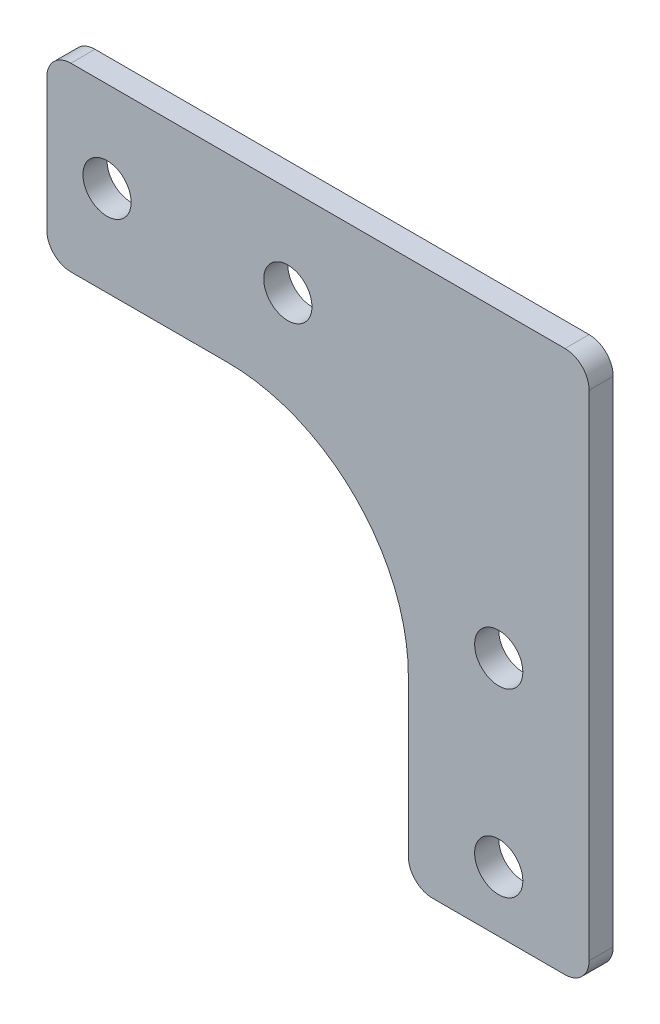
ISO-10303-21;
HEADER;
FILE_DESCRIPTION(('STEP AP214'),'2;1');
FILE_NAME('part.step','',(''),(''),'','','');
FILE_SCHEMA(('AUTOMOTIVE_DESIGN { 1 0 10303 214 1 1 1 1 }'));
ENDSEC;
DATA;
#1=APPLICATION_CONTEXT('core data for automotive mechanical design processes');
#2=APPLICATION_PROTOCOL_DEFINITION('international standard','automotive_design',2000,#1);
#3=PRODUCT_CONTEXT('',#1,'mechanical');
#4=PRODUCT('Part','Part','',(#3));
#5=PRODUCT_RELATED_PRODUCT_CATEGORY('part','',(#4));
#6=PRODUCT_DEFINITION_FORMATION('','',#4);
#7=PRODUCT_DEFINITION_CONTEXT('part definition',#1,'design');
#8=PRODUCT_DEFINITION('design','',#6,#7);
#9=PRODUCT_DEFINITION_SHAPE('','',#8);
#10=(LENGTH_UNIT() NAMED_UNIT(*) SI_UNIT(.MILLI.,.METRE.));
#11=(NAMED_UNIT(*) PLANE_ANGLE_UNIT() SI_UNIT($,.RADIAN.));
#12=(NAMED_UNIT(*) SI_UNIT($,.STERADIAN.) SOLID_ANGLE_UNIT());
#13=UNCERTAINTY_MEASURE_WITH_UNIT(LENGTH_MEASURE(1.E-05),#10,'distance_accuracy_value','');
#14=(GEOMETRIC_REPRESENTATION_CONTEXT(3) GLOBAL_UNCERTAINTY_ASSIGNED_CONTEXT((#13)) GLOBAL_UNIT_ASSIGNED_CONTEXT((#10,
#11,#12)) REPRESENTATION_CONTEXT('',''));
#15=CARTESIAN_POINT('',(0.,0.,0.));
#16=DIRECTION('',(0.,0.,1.));
#17=DIRECTION('',(1.,0.,0.));
#18=AXIS2_PLACEMENT_3D('',#15,#16,#17);
#19=CARTESIAN_POINT('',(-45.,0.,2.));
#20=DIRECTION('',(0.,-1.,0.));
#21=DIRECTION('',(0.,0.,-1.));
#22=AXIS2_PLACEMENT_3D('',#19,#20,#21);
#23=PLANE('',#22);
#24=DIRECTION('',(-1.,0.,0.));
#25=VECTOR('',#24,1.);
#26=CARTESIAN_POINT('',(-45.,0.,2.));
#27=LINE('',#26,#25);
#28=CARTESIAN_POINT('',(-2.00000000000002,0.,2.));
#29=VERTEX_POINT('',#28);
#30=CARTESIAN_POINT('',(-43.,0.,2.));
#31=VERTEX_POINT('',#30);
#32=EDGE_CURVE('E173',#29,#31,#27,.T.);
#33=ORIENTED_EDGE('',*,*,#32,.F.);
#34=DIRECTION('',(0.,0.,-1.));
#35=VECTOR('',#34,1.);
#36=CARTESIAN_POINT('',(-2.,0.,2.));
#37=LINE('',#36,#35);
#38=CARTESIAN_POINT('',(-2.00000000000002,0.,0.));
#39=VERTEX_POINT('',#38);
#40=EDGE_CURVE('E205',#29,#39,#37,.T.);
#41=ORIENTED_EDGE('',*,*,#40,.T.);
#42=DIRECTION('',(-1.,0.,0.));
#43=VECTOR('',#42,1.);
#44=CARTESIAN_POINT('',(-45.,0.,0.));
#45=LINE('',#44,#43);
#46=CARTESIAN_POINT('',(-43.,0.,0.));
#47=VERTEX_POINT('',#46);
#48=EDGE_CURVE('E155',#39,#47,#45,.T.);
#49=ORIENTED_EDGE('',*,*,#48,.T.);
#50=DIRECTION('',(0.,0.,-1.));
#51=VECTOR('',#50,1.);
#52=CARTESIAN_POINT('',(-43.,0.,2.));
#53=LINE('',#52,#51);
#54=EDGE_CURVE('E203',#47,#31,#53,.F.);
#55=ORIENTED_EDGE('',*,*,#54,.T.);
#56=EDGE_LOOP('',(#33,#41,#49,#55));
#57=FACE_BOUND('',#56,.T.);
#58=ADVANCED_FACE('F33',(#57),#23,.F.);
#59=CARTESIAN_POINT('',(-45.,-15.,2.));
#60=DIRECTION('',(1.,0.,0.));
#61=DIRECTION('',(0.,0.,-1.));
#62=AXIS2_PLACEMENT_3D('',#59,#60,#61);
#63=PLANE('',#62);
#64=DIRECTION('',(0.,-1.,0.));
#65=VECTOR('',#64,1.);
#66=CARTESIAN_POINT('',(-45.,-15.,0.));
#67=LINE('',#66,#65);
#68=CARTESIAN_POINT('',(-45.,-2.,0.));
#69=VERTEX_POINT('',#68);
#70=CARTESIAN_POINT('',(-45.,-13.,0.));
#71=VERTEX_POINT('',#70);
#72=EDGE_CURVE('E158',#69,#71,#67,.T.);
#73=ORIENTED_EDGE('',*,*,#72,.T.);
#74=DIRECTION('',(0.,0.,-1.));
#75=VECTOR('',#74,1.);
#76=CARTESIAN_POINT('',(-45.,-13.,2.));
#77=LINE('',#76,#75);
#78=CARTESIAN_POINT('',(-45.,-13.,2.));
#79=VERTEX_POINT('',#78);
#80=EDGE_CURVE('E11',#71,#79,#77,.F.);
#81=ORIENTED_EDGE('',*,*,#80,.T.);
#82=DIRECTION('',(0.,-1.,0.));
#83=VECTOR('',#82,1.);
#84=CARTESIAN_POINT('',(-45.,-15.,2.));
#85=LINE('',#84,#83);
#86=CARTESIAN_POINT('',(-45.,-2.,2.));
#87=VERTEX_POINT('',#86);
#88=EDGE_CURVE('E131',#87,#79,#85,.T.);
#89=ORIENTED_EDGE('',*,*,#88,.F.);
#90=DIRECTION('',(0.,0.,-1.));
#91=VECTOR('',#90,1.);
#92=CARTESIAN_POINT('',(-45.,-2.,2.));
#93=LINE('',#92,#91);
#94=EDGE_CURVE('E41',#87,#69,#93,.T.);
#95=ORIENTED_EDGE('',*,*,#94,.T.);
#96=EDGE_LOOP('',(#73,#81,#89,#95));
#97=FACE_BOUND('',#96,.T.);
#98=ADVANCED_FACE('F215',(#97),#63,.F.);
#99=CARTESIAN_POINT('',(-30.,-15.,2.));
#100=DIRECTION('',(0.,1.,0.));
#101=DIRECTION('',(0.,0.,1.));
#102=AXIS2_PLACEMENT_3D('',#99,#100,#101);
#103=PLANE('',#102);
#104=DIRECTION('',(1.,0.,0.));
#105=VECTOR('',#104,1.);
#106=CARTESIAN_POINT('',(-30.,-15.,2.));
#107=LINE('',#106,#105);
#108=CARTESIAN_POINT('',(-43.,-15.,2.));
#109=VERTEX_POINT('',#108);
#110=CARTESIAN_POINT('',(-30.,-15.,2.));
#111=VERTEX_POINT('',#110);
#112=EDGE_CURVE('E121',#109,#111,#107,.T.);
#113=ORIENTED_EDGE('',*,*,#112,.F.);
#114=DIRECTION('',(0.,0.,-1.));
#115=VECTOR('',#114,1.);
#116=CARTESIAN_POINT('',(-43.,-15.,2.));
#117=LINE('',#116,#115);
#118=CARTESIAN_POINT('',(-43.,-15.,0.));
#119=VERTEX_POINT('',#118);
#120=EDGE_CURVE('E209',#109,#119,#117,.T.);
#121=ORIENTED_EDGE('',*,*,#120,.T.);
#122=DIRECTION('',(1.,0.,0.));
#123=VECTOR('',#122,1.);
#124=CARTESIAN_POINT('',(-30.,-15.,0.));
#125=LINE('',#124,#123);
#126=CARTESIAN_POINT('',(-30.,-15.,0.));
#127=VERTEX_POINT('',#126);
#128=EDGE_CURVE('E137',#119,#127,#125,.T.);
#129=ORIENTED_EDGE('',*,*,#128,.T.);
#130=DIRECTION('',(0.,0.,-1.));
#131=VECTOR('',#130,1.);
#132=CARTESIAN_POINT('',(-30.,-15.,2.));
#133=LINE('',#132,#131);
#134=EDGE_CURVE('E134',#111,#127,#133,.T.);
#135=ORIENTED_EDGE('',*,*,#134,.F.);
#136=EDGE_LOOP('',(#113,#121,#129,#135));
#137=FACE_BOUND('',#136,.T.);
#138=ADVANCED_FACE('F135',(#137),#103,.F.);
#139=CARTESIAN_POINT('',(-30.,-30.,2.));
#140=DIRECTION('',(0.,0.,-1.));
#141=DIRECTION('',(-1.,0.,0.));
#142=AXIS2_PLACEMENT_3D('',#139,#140,#141);
#143=CYLINDRICAL_SURFACE('',#142,15.);
#144=CARTESIAN_POINT('',(-30.,-30.,0.));
#145=DIRECTION('',(0.,0.,-1.));
#146=DIRECTION('',(1.,0.,0.));
#147=AXIS2_PLACEMENT_3D('',#144,#145,#146);
#148=CIRCLE('',#147,15.);
#149=CARTESIAN_POINT('',(-15.,-30.,0.));
#150=VERTEX_POINT('',#149);
#151=EDGE_CURVE('E163',#127,#150,#148,.T.);
#152=ORIENTED_EDGE('',*,*,#151,.T.);
#153=DIRECTION('',(0.,0.,-1.));
#154=VECTOR('',#153,1.);
#155=CARTESIAN_POINT('',(-15.,-30.,2.));
#156=LINE('',#155,#154);
#157=CARTESIAN_POINT('',(-15.,-30.,2.));
#158=VERTEX_POINT('',#157);
#159=EDGE_CURVE('E141',#158,#150,#156,.T.);
#160=ORIENTED_EDGE('',*,*,#159,.F.);
#161=CARTESIAN_POINT('',(-30.,-30.,2.));
#162=DIRECTION('',(0.,0.,-1.));
#163=DIRECTION('',(1.,0.,0.));
#164=AXIS2_PLACEMENT_3D('',#161,#162,#163);
#165=CIRCLE('',#164,15.);
#166=EDGE_CURVE('E126',#111,#158,#165,.T.);
#167=ORIENTED_EDGE('',*,*,#166,.F.);
#168=ORIENTED_EDGE('',*,*,#134,.T.);
#169=EDGE_LOOP('',(#152,#160,#167,#168));
#170=FACE_BOUND('',#169,.T.);
#171=ADVANCED_FACE('F143',(#170),#143,.F.);
#172=CARTESIAN_POINT('',(-15.,-45.,2.));
#173=DIRECTION('',(1.,0.,0.));
#174=DIRECTION('',(0.,1.,0.));
#175=AXIS2_PLACEMENT_3D('',#172,#173,#174);
#176=PLANE('',#175);
#177=DIRECTION('',(0.,-1.,0.));
#178=VECTOR('',#177,1.);
#179=CARTESIAN_POINT('',(-15.,-45.,0.));
#180=LINE('',#179,#178);
#181=CARTESIAN_POINT('',(-15.,-43.,0.));
#182=VERTEX_POINT('',#181);
#183=EDGE_CURVE('E165',#150,#182,#180,.T.);
#184=ORIENTED_EDGE('',*,*,#183,.T.);
#185=DIRECTION('',(0.,0.,-1.));
#186=VECTOR('',#185,1.);
#187=CARTESIAN_POINT('',(-15.,-43.,2.));
#188=LINE('',#187,#186);
#189=CARTESIAN_POINT('',(-15.,-43.,2.));
#190=VERTEX_POINT('',#189);
#191=EDGE_CURVE('E48',#182,#190,#188,.F.);
#192=ORIENTED_EDGE('',*,*,#191,.T.);
#193=DIRECTION('',(0.,-1.,0.));
#194=VECTOR('',#193,1.);
#195=CARTESIAN_POINT('',(-15.,-45.,2.));
#196=LINE('',#195,#194);
#197=EDGE_CURVE('E145',#158,#190,#196,.T.);
#198=ORIENTED_EDGE('',*,*,#197,.F.);
#199=ORIENTED_EDGE('',*,*,#159,.T.);
#200=EDGE_LOOP('',(#184,#192,#198,#199));
#201=FACE_BOUND('',#200,.T.);
#202=ADVANCED_FACE('F327',(#201),#176,.F.);
#203=CARTESIAN_POINT('',(0.,-45.,2.));
#204=DIRECTION('',(0.,1.,0.));
#205=DIRECTION('',(0.,0.,1.));
#206=AXIS2_PLACEMENT_3D('',#203,#204,#205);
#207=PLANE('',#206);
#208=DIRECTION('',(1.,0.,0.));
#209=VECTOR('',#208,1.);
#210=CARTESIAN_POINT('',(0.,-45.,0.));
#211=LINE('',#210,#209);
#212=CARTESIAN_POINT('',(-13.,-45.,0.));
#213=VERTEX_POINT('',#212);
#214=CARTESIAN_POINT('',(-1.99999999999999,-45.,0.));
#215=VERTEX_POINT('',#214);
#216=EDGE_CURVE('E167',#213,#215,#211,.T.);
#217=ORIENTED_EDGE('',*,*,#216,.T.);
#218=DIRECTION('',(0.,0.,-1.));
#219=VECTOR('',#218,1.);
#220=CARTESIAN_POINT('',(-1.99999999999999,-45.,2.));
#221=LINE('',#220,#219);
#222=CARTESIAN_POINT('',(-1.99999999999999,-45.,2.));
#223=VERTEX_POINT('',#222);
#224=EDGE_CURVE('E192',#215,#223,#221,.F.);
#225=ORIENTED_EDGE('',*,*,#224,.T.);
#226=DIRECTION('',(1.,0.,0.));
#227=VECTOR('',#226,1.);
#228=CARTESIAN_POINT('',(0.,-45.,2.));
#229=LINE('',#228,#227);
#230=CARTESIAN_POINT('',(-13.,-45.,2.));
#231=VERTEX_POINT('',#230);
#232=EDGE_CURVE('E147',#231,#223,#229,.T.);
#233=ORIENTED_EDGE('',*,*,#232,.F.);
#234=DIRECTION('',(0.,0.,-1.));
#235=VECTOR('',#234,1.);
#236=CARTESIAN_POINT('',(-13.,-45.,2.));
#237=LINE('',#236,#235);
#238=EDGE_CURVE('E189',#231,#213,#237,.T.);
#239=ORIENTED_EDGE('',*,*,#238,.T.);
#240=EDGE_LOOP('',(#217,#225,#233,#239));
#241=FACE_BOUND('',#240,.T.);
#242=ADVANCED_FACE('F322',(#241),#207,.F.);
#243=CARTESIAN_POINT('',(0.,0.,2.));
#244=DIRECTION('',(-1.,0.,0.));
#245=DIRECTION('',(0.,-1.,0.));
#246=AXIS2_PLACEMENT_3D('',#243,#244,#245);
#247=PLANE('',#246);
#248=DIRECTION('',(0.,1.,0.));
#249=VECTOR('',#248,1.);
#250=CARTESIAN_POINT('',(0.,0.,2.));
#251=LINE('',#250,#249);
#252=CARTESIAN_POINT('',(0.,-43.,2.));
#253=VERTEX_POINT('',#252);
#254=CARTESIAN_POINT('',(0.,-2.,2.));
#255=VERTEX_POINT('',#254);
#256=EDGE_CURVE('E152',#253,#255,#251,.T.);
#257=ORIENTED_EDGE('',*,*,#256,.F.);
#258=DIRECTION('',(0.,0.,-1.));
#259=VECTOR('',#258,1.);
#260=CARTESIAN_POINT('',(0.,-43.,2.));
#261=LINE('',#260,#259);
#262=CARTESIAN_POINT('',(0.,-43.,0.));
#263=VERTEX_POINT('',#262);
#264=EDGE_CURVE('E176',#253,#263,#261,.T.);
#265=ORIENTED_EDGE('',*,*,#264,.T.);
#266=DIRECTION('',(0.,1.,0.));
#267=VECTOR('',#266,1.);
#268=CARTESIAN_POINT('',(0.,0.,0.));
#269=LINE('',#268,#267);
#270=CARTESIAN_POINT('',(0.,-2.,0.));
#271=VERTEX_POINT('',#270);
#272=EDGE_CURVE('E170',#263,#271,#269,.T.);
#273=ORIENTED_EDGE('',*,*,#272,.T.);
#274=DIRECTION('',(0.,0.,-1.));
#275=VECTOR('',#274,1.);
#276=CARTESIAN_POINT('',(0.,-2.,2.));
#277=LINE('',#276,#275);
#278=EDGE_CURVE('E140',#271,#255,#277,.F.);
#279=ORIENTED_EDGE('',*,*,#278,.T.);
#280=EDGE_LOOP('',(#257,#265,#273,#279));
#281=FACE_BOUND('',#280,.T.);
#282=ADVANCED_FACE('F264',(#281),#247,.F.);
#283=CARTESIAN_POINT('',(-30.,-30.,2.));
#284=DIRECTION('',(0.,0.,1.));
#285=DIRECTION('',(1.,0.,0.));
#286=AXIS2_PLACEMENT_3D('',#283,#284,#285);
#287=PLANE('',#286);
#288=CARTESIAN_POINT('',(-7.5,-25.,2.));
#289=DIRECTION('',(0.,0.,1.));
#290=DIRECTION('',(1.,0.,0.));
#291=AXIS2_PLACEMENT_3D('',#288,#289,#290);
#292=CIRCLE('',#291,2.);
#293=CARTESIAN_POINT('',(-5.5,-25.,2.));
#294=VERTEX_POINT('',#293);
#295=EDGE_CURVE('E246',#294,#294,#292,.T.);
#296=ORIENTED_EDGE('',*,*,#295,.F.);
#297=EDGE_LOOP('',(#296));
#298=FACE_BOUND('',#297,.T.);
#299=CARTESIAN_POINT('',(-25.,-7.5,2.));
#300=DIRECTION('',(0.,0.,1.));
#301=DIRECTION('',(1.,0.,0.));
#302=AXIS2_PLACEMENT_3D('',#299,#300,#301);
#303=CIRCLE('',#302,2.);
#304=CARTESIAN_POINT('',(-23.,-7.5,2.));
#305=VERTEX_POINT('',#304);
#306=EDGE_CURVE('E240',#305,#305,#303,.T.);
#307=ORIENTED_EDGE('',*,*,#306,.F.);
#308=EDGE_LOOP('',(#307));
#309=FACE_BOUND('',#308,.T.);
#310=CARTESIAN_POINT('',(-40.,-7.5,2.));
#311=DIRECTION('',(0.,0.,1.));
#312=DIRECTION('',(1.,0.,0.));
#313=AXIS2_PLACEMENT_3D('',#310,#311,#312);
#314=CIRCLE('',#313,2.);
#315=CARTESIAN_POINT('',(-38.,-7.5,2.));
#316=VERTEX_POINT('',#315);
#317=EDGE_CURVE('E234',#316,#316,#314,.T.);
#318=ORIENTED_EDGE('',*,*,#317,.F.);
#319=EDGE_LOOP('',(#318));
#320=FACE_BOUND('',#319,.T.);
#321=CARTESIAN_POINT('',(-7.5,-40.,2.));
#322=DIRECTION('',(0.,0.,1.));
#323=DIRECTION('',(1.,0.,0.));
#324=AXIS2_PLACEMENT_3D('',#321,#322,#323);
#325=CIRCLE('',#324,2.);
#326=CARTESIAN_POINT('',(-5.5,-40.,2.));
#327=VERTEX_POINT('',#326);
#328=EDGE_CURVE('E228',#327,#327,#325,.T.);
#329=ORIENTED_EDGE('',*,*,#328,.F.);
#330=EDGE_LOOP('',(#329));
#331=FACE_BOUND('',#330,.T.);
#332=ORIENTED_EDGE('',*,*,#232,.T.);
#333=CARTESIAN_POINT('',(-1.99999999999999,-43.,2.));
#334=DIRECTION('',(0.,0.,1.));
#335=DIRECTION('',(1.,0.,0.));
#336=AXIS2_PLACEMENT_3D('',#333,#334,#335);
#337=CIRCLE('',#336,2.);
#338=EDGE_CURVE('E201',#223,#253,#337,.T.);
#339=ORIENTED_EDGE('',*,*,#338,.T.);
#340=ORIENTED_EDGE('',*,*,#256,.T.);
#341=CARTESIAN_POINT('',(-2.,-2.,2.));
#342=DIRECTION('',(0.,0.,1.));
#343=DIRECTION('',(1.,0.,0.));
#344=AXIS2_PLACEMENT_3D('',#341,#342,#343);
#345=CIRCLE('',#344,2.);
#346=EDGE_CURVE('E199',#255,#29,#345,.T.);
#347=ORIENTED_EDGE('',*,*,#346,.T.);
#348=ORIENTED_EDGE('',*,*,#32,.T.);
#349=CARTESIAN_POINT('',(-43.,-2.,2.));
#350=DIRECTION('',(0.,0.,1.));
#351=DIRECTION('',(1.,0.,0.));
#352=AXIS2_PLACEMENT_3D('',#349,#350,#351);
#353=CIRCLE('',#352,2.);
#354=EDGE_CURVE('E194',#31,#87,#353,.T.);
#355=ORIENTED_EDGE('',*,*,#354,.T.);
#356=ORIENTED_EDGE('',*,*,#88,.T.);
#357=CARTESIAN_POINT('',(-43.,-13.,2.));
#358=DIRECTION('',(0.,0.,1.));
#359=DIRECTION('',(1.,0.,0.));
#360=AXIS2_PLACEMENT_3D('',#357,#358,#359);
#361=CIRCLE('',#360,2.);
#362=EDGE_CURVE('E56',#79,#109,#361,.T.);
#363=ORIENTED_EDGE('',*,*,#362,.T.);
#364=ORIENTED_EDGE('',*,*,#112,.T.);
#365=ORIENTED_EDGE('',*,*,#166,.T.);
#366=ORIENTED_EDGE('',*,*,#197,.T.);
#367=CARTESIAN_POINT('',(-13.,-43.,2.));
#368=DIRECTION('',(0.,0.,1.));
#369=DIRECTION('',(1.,0.,0.));
#370=AXIS2_PLACEMENT_3D('',#367,#368,#369);
#371=CIRCLE('',#370,2.);
#372=EDGE_CURVE('E197',#190,#231,#371,.T.);
#373=ORIENTED_EDGE('',*,*,#372,.T.);
#374=EDGE_LOOP('',(#332,#339,#340,#347,#348,#355,#356,#363,#364,#365,#366,#373));
#375=FACE_BOUND('',#374,.T.);
#376=ADVANCED_FACE('F124',(#298,#309,#320,#331,#375),#287,.T.);
#377=CARTESIAN_POINT('',(-30.,-30.,0.));
#378=DIRECTION('',(0.,0.,1.));
#379=DIRECTION('',(1.,0.,0.));
#380=AXIS2_PLACEMENT_3D('',#377,#378,#379);
#381=PLANE('',#380);
#382=CARTESIAN_POINT('',(-7.5,-25.,0.));
#383=DIRECTION('',(0.,0.,1.));
#384=DIRECTION('',(1.,0.,0.));
#385=AXIS2_PLACEMENT_3D('',#382,#383,#384);
#386=CIRCLE('',#385,2.);
#387=CARTESIAN_POINT('',(-5.5,-25.,0.));
#388=VERTEX_POINT('',#387);
#389=EDGE_CURVE('E231',#388,#388,#386,.T.);
#390=ORIENTED_EDGE('',*,*,#389,.T.);
#391=EDGE_LOOP('',(#390));
#392=FACE_BOUND('',#391,.T.);
#393=CARTESIAN_POINT('',(-25.,-7.5,0.));
#394=DIRECTION('',(0.,0.,1.));
#395=DIRECTION('',(1.,0.,0.));
#396=AXIS2_PLACEMENT_3D('',#393,#394,#395);
#397=CIRCLE('',#396,2.);
#398=CARTESIAN_POINT('',(-23.,-7.5,0.));
#399=VERTEX_POINT('',#398);
#400=EDGE_CURVE('E243',#399,#399,#397,.T.);
#401=ORIENTED_EDGE('',*,*,#400,.T.);
#402=EDGE_LOOP('',(#401));
#403=FACE_BOUND('',#402,.T.);
#404=CARTESIAN_POINT('',(-40.,-7.5,0.));
#405=DIRECTION('',(0.,0.,1.));
#406=DIRECTION('',(1.,0.,0.));
#407=AXIS2_PLACEMENT_3D('',#404,#405,#406);
#408=CIRCLE('',#407,2.);
#409=CARTESIAN_POINT('',(-38.,-7.5,0.));
#410=VERTEX_POINT('',#409);
#411=EDGE_CURVE('E237',#410,#410,#408,.T.);
#412=ORIENTED_EDGE('',*,*,#411,.T.);
#413=EDGE_LOOP('',(#412));
#414=FACE_BOUND('',#413,.T.);
#415=CARTESIAN_POINT('',(-7.5,-40.,0.));
#416=DIRECTION('',(0.,0.,1.));
#417=DIRECTION('',(1.,0.,0.));
#418=AXIS2_PLACEMENT_3D('',#415,#416,#417);
#419=CIRCLE('',#418,2.);
#420=CARTESIAN_POINT('',(-5.5,-40.,0.));
#421=VERTEX_POINT('',#420);
#422=EDGE_CURVE('E159',#421,#421,#419,.T.);
#423=ORIENTED_EDGE('',*,*,#422,.T.);
#424=EDGE_LOOP('',(#423));
#425=FACE_BOUND('',#424,.T.);
#426=ORIENTED_EDGE('',*,*,#272,.F.);
#427=CARTESIAN_POINT('',(-1.99999999999999,-43.,0.));
#428=DIRECTION('',(0.,0.,1.));
#429=DIRECTION('',(1.,0.,0.));
#430=AXIS2_PLACEMENT_3D('',#427,#428,#429);
#431=CIRCLE('',#430,2.);
#432=EDGE_CURVE('E187',#263,#215,#431,.F.);
#433=ORIENTED_EDGE('',*,*,#432,.T.);
#434=ORIENTED_EDGE('',*,*,#216,.F.);
#435=CARTESIAN_POINT('',(-13.,-43.,0.));
#436=DIRECTION('',(0.,0.,1.));
#437=DIRECTION('',(1.,0.,0.));
#438=AXIS2_PLACEMENT_3D('',#435,#436,#437);
#439=CIRCLE('',#438,2.);
#440=EDGE_CURVE('E183',#213,#182,#439,.F.);
#441=ORIENTED_EDGE('',*,*,#440,.T.);
#442=ORIENTED_EDGE('',*,*,#183,.F.);
#443=ORIENTED_EDGE('',*,*,#151,.F.);
#444=ORIENTED_EDGE('',*,*,#128,.F.);
#445=CARTESIAN_POINT('',(-43.,-13.,0.));
#446=DIRECTION('',(0.,0.,1.));
#447=DIRECTION('',(1.,0.,0.));
#448=AXIS2_PLACEMENT_3D('',#445,#446,#447);
#449=CIRCLE('',#448,2.);
#450=EDGE_CURVE('E181',#119,#71,#449,.F.);
#451=ORIENTED_EDGE('',*,*,#450,.T.);
#452=ORIENTED_EDGE('',*,*,#72,.F.);
#453=CARTESIAN_POINT('',(-43.,-2.,0.));
#454=DIRECTION('',(0.,0.,1.));
#455=DIRECTION('',(1.,0.,0.));
#456=AXIS2_PLACEMENT_3D('',#453,#454,#455);
#457=CIRCLE('',#456,2.);
#458=EDGE_CURVE('E179',#69,#47,#457,.F.);
#459=ORIENTED_EDGE('',*,*,#458,.T.);
#460=ORIENTED_EDGE('',*,*,#48,.F.);
#461=CARTESIAN_POINT('',(-2.,-2.,0.));
#462=DIRECTION('',(0.,0.,1.));
#463=DIRECTION('',(1.,0.,0.));
#464=AXIS2_PLACEMENT_3D('',#461,#462,#463);
#465=CIRCLE('',#464,2.);
#466=EDGE_CURVE('E185',#39,#271,#465,.F.);
#467=ORIENTED_EDGE('',*,*,#466,.T.);
#468=EDGE_LOOP('',(#426,#433,#434,#441,#442,#443,#444,#451,#452,#459,#460,#467));
#469=FACE_BOUND('',#468,.T.);
#470=ADVANCED_FACE('F221',(#392,#403,#414,#425,#469),#381,.F.);
#471=CARTESIAN_POINT('',(-7.5,-40.,0.));
#472=DIRECTION('',(0.,0.,1.));
#473=DIRECTION('',(1.,0.,0.));
#474=AXIS2_PLACEMENT_3D('',#471,#472,#473);
#475=CYLINDRICAL_SURFACE('',#474,2.);
#476=ORIENTED_EDGE('',*,*,#422,.F.);
#477=EDGE_LOOP('',(#476));
#478=FACE_BOUND('',#477,.T.);
#479=ORIENTED_EDGE('',*,*,#328,.T.);
#480=EDGE_LOOP('',(#479));
#481=FACE_BOUND('',#480,.T.);
#482=ADVANCED_FACE('F272',(#478,#481),#475,.F.);
#483=CARTESIAN_POINT('',(-40.,-7.5,0.));
#484=DIRECTION('',(0.,0.,1.));
#485=DIRECTION('',(1.,0.,0.));
#486=AXIS2_PLACEMENT_3D('',#483,#484,#485);
#487=CYLINDRICAL_SURFACE('',#486,2.);
#488=ORIENTED_EDGE('',*,*,#411,.F.);
#489=EDGE_LOOP('',(#488));
#490=FACE_BOUND('',#489,.T.);
#491=ORIENTED_EDGE('',*,*,#317,.T.);
#492=EDGE_LOOP('',(#491));
#493=FACE_BOUND('',#492,.T.);
#494=ADVANCED_FACE('F274',(#490,#493),#487,.F.);
#495=CARTESIAN_POINT('',(-25.,-7.5,0.));
#496=DIRECTION('',(0.,0.,1.));
#497=DIRECTION('',(1.,0.,0.));
#498=AXIS2_PLACEMENT_3D('',#495,#496,#497);
#499=CYLINDRICAL_SURFACE('',#498,2.);
#500=ORIENTED_EDGE('',*,*,#400,.F.);
#501=EDGE_LOOP('',(#500));
#502=FACE_BOUND('',#501,.T.);
#503=ORIENTED_EDGE('',*,*,#306,.T.);
#504=EDGE_LOOP('',(#503));
#505=FACE_BOUND('',#504,.T.);
#506=ADVANCED_FACE('F258',(#502,#505),#499,.F.);
#507=CARTESIAN_POINT('',(-7.5,-25.,0.));
#508=DIRECTION('',(0.,0.,1.));
#509=DIRECTION('',(1.,0.,0.));
#510=AXIS2_PLACEMENT_3D('',#507,#508,#509);
#511=CYLINDRICAL_SURFACE('',#510,2.);
#512=ORIENTED_EDGE('',*,*,#389,.F.);
#513=EDGE_LOOP('',(#512));
#514=FACE_BOUND('',#513,.T.);
#515=ORIENTED_EDGE('',*,*,#295,.T.);
#516=EDGE_LOOP('',(#515));
#517=FACE_BOUND('',#516,.T.);
#518=ADVANCED_FACE('F254',(#514,#517),#511,.F.);
#519=CARTESIAN_POINT('',(-1.99999999999999,-43.,2.));
#520=DIRECTION('',(0.,0.,-1.));
#521=DIRECTION('',(-1.,0.,0.));
#522=AXIS2_PLACEMENT_3D('',#519,#520,#521);
#523=CYLINDRICAL_SURFACE('',#522,2.);
#524=ORIENTED_EDGE('',*,*,#338,.F.);
#525=ORIENTED_EDGE('',*,*,#224,.F.);
#526=ORIENTED_EDGE('',*,*,#432,.F.);
#527=ORIENTED_EDGE('',*,*,#264,.F.);
#528=EDGE_LOOP('',(#524,#525,#526,#527));
#529=FACE_BOUND('',#528,.T.);
#530=ADVANCED_FACE('F257',(#529),#523,.T.);
#531=CARTESIAN_POINT('',(-2.,-2.,2.));
#532=DIRECTION('',(0.,0.,-1.));
#533=DIRECTION('',(-1.,0.,0.));
#534=AXIS2_PLACEMENT_3D('',#531,#532,#533);
#535=CYLINDRICAL_SURFACE('',#534,2.);
#536=ORIENTED_EDGE('',*,*,#346,.F.);
#537=ORIENTED_EDGE('',*,*,#278,.F.);
#538=ORIENTED_EDGE('',*,*,#466,.F.);
#539=ORIENTED_EDGE('',*,*,#40,.F.);
#540=EDGE_LOOP('',(#536,#537,#538,#539));
#541=FACE_BOUND('',#540,.T.);
#542=ADVANCED_FACE('F297',(#541),#535,.T.);
#543=CARTESIAN_POINT('',(-13.,-43.,2.));
#544=DIRECTION('',(0.,0.,-1.));
#545=DIRECTION('',(-1.,0.,0.));
#546=AXIS2_PLACEMENT_3D('',#543,#544,#545);
#547=CYLINDRICAL_SURFACE('',#546,2.);
#548=ORIENTED_EDGE('',*,*,#372,.F.);
#549=ORIENTED_EDGE('',*,*,#191,.F.);
#550=ORIENTED_EDGE('',*,*,#440,.F.);
#551=ORIENTED_EDGE('',*,*,#238,.F.);
#552=EDGE_LOOP('',(#548,#549,#550,#551));
#553=FACE_BOUND('',#552,.T.);
#554=ADVANCED_FACE('F301',(#553),#547,.T.);
#555=CARTESIAN_POINT('',(-43.,-13.,2.));
#556=DIRECTION('',(0.,0.,-1.));
#557=DIRECTION('',(-1.,0.,0.));
#558=AXIS2_PLACEMENT_3D('',#555,#556,#557);
#559=CYLINDRICAL_SURFACE('',#558,2.);
#560=ORIENTED_EDGE('',*,*,#362,.F.);
#561=ORIENTED_EDGE('',*,*,#80,.F.);
#562=ORIENTED_EDGE('',*,*,#450,.F.);
#563=ORIENTED_EDGE('',*,*,#120,.F.);
#564=EDGE_LOOP('',(#560,#561,#562,#563));
#565=FACE_BOUND('',#564,.T.);
#566=ADVANCED_FACE('F224',(#565),#559,.T.);
#567=CARTESIAN_POINT('',(-43.,-2.,2.));
#568=DIRECTION('',(0.,0.,-1.));
#569=DIRECTION('',(-1.,0.,0.));
#570=AXIS2_PLACEMENT_3D('',#567,#568,#569);
#571=CYLINDRICAL_SURFACE('',#570,2.);
#572=ORIENTED_EDGE('',*,*,#354,.F.);
#573=ORIENTED_EDGE('',*,*,#54,.F.);
#574=ORIENTED_EDGE('',*,*,#458,.F.);
#575=ORIENTED_EDGE('',*,*,#94,.F.);
#576=EDGE_LOOP('',(#572,#573,#574,#575));
#577=FACE_BOUND('',#576,.T.);
#578=ADVANCED_FACE('F35',(#577),#571,.T.);
#579=CLOSED_SHELL('',(#58,#98,#138,#171,#202,#242,#282,#376,#470,#482,#494,#506,#518,#530,#542,
#554,#566,#578));
#580=MANIFOLD_SOLID_BREP('B2',#579);
#581=ADVANCED_BREP_SHAPE_REPRESENTATION('',(#18,#580),#14);
#582=SHAPE_DEFINITION_REPRESENTATION(#9,#581);
ENDSEC;
END-ISO-10303-21;
